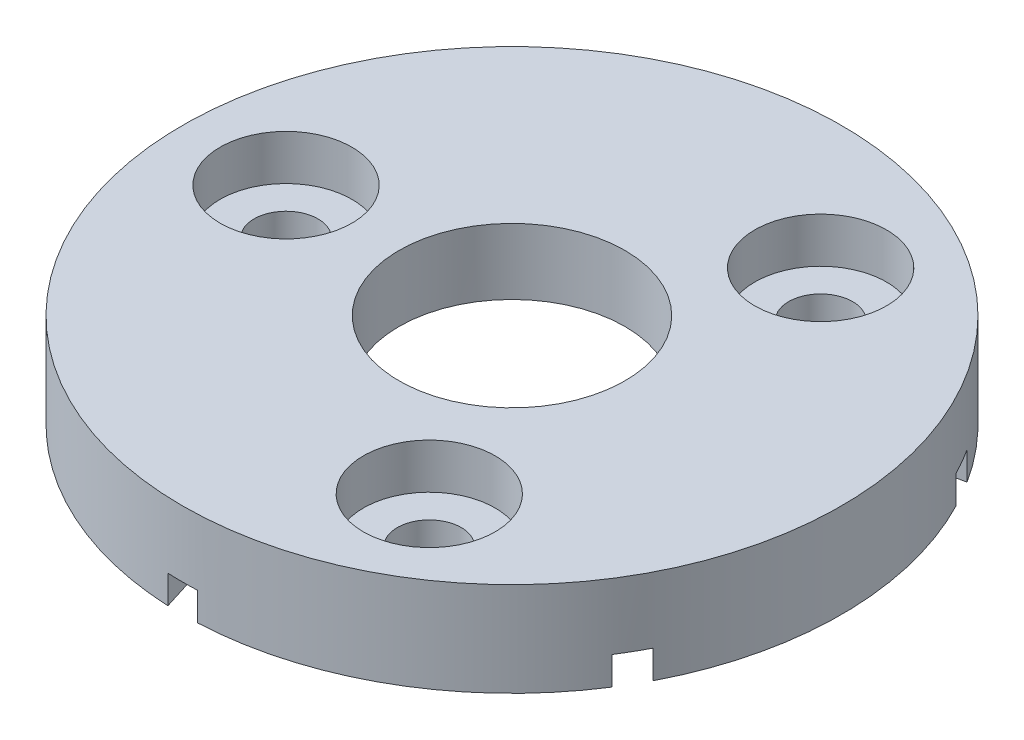
ISO-10303-21;
HEADER;
FILE_DESCRIPTION(('STEP AP214'),'2;1');
FILE_NAME('part.step','',(''),(''),'','','');
FILE_SCHEMA(('AUTOMOTIVE_DESIGN { 1 0 10303 214 1 1 1 1 }'));
ENDSEC;
DATA;
#1=APPLICATION_CONTEXT('core data for automotive mechanical design processes');
#2=APPLICATION_PROTOCOL_DEFINITION('international standard','automotive_design',2000,#1);
#3=PRODUCT_CONTEXT('',#1,'mechanical');
#4=PRODUCT('Part','Part','',(#3));
#5=PRODUCT_RELATED_PRODUCT_CATEGORY('part','',(#4));
#6=PRODUCT_DEFINITION_FORMATION('','',#4);
#7=PRODUCT_DEFINITION_CONTEXT('part definition',#1,'design');
#8=PRODUCT_DEFINITION('design','',#6,#7);
#9=PRODUCT_DEFINITION_SHAPE('','',#8);
#10=(LENGTH_UNIT() NAMED_UNIT(*) SI_UNIT(.MILLI.,.METRE.));
#11=(NAMED_UNIT(*) PLANE_ANGLE_UNIT() SI_UNIT($,.RADIAN.));
#12=(NAMED_UNIT(*) SI_UNIT($,.STERADIAN.) SOLID_ANGLE_UNIT());
#13=UNCERTAINTY_MEASURE_WITH_UNIT(LENGTH_MEASURE(1.E-05),#10,'distance_accuracy_value','');
#14=(GEOMETRIC_REPRESENTATION_CONTEXT(3) GLOBAL_UNCERTAINTY_ASSIGNED_CONTEXT((#13)) GLOBAL_UNIT_ASSIGNED_CONTEXT((#10,
#11,#12)) REPRESENTATION_CONTEXT('',''));
#15=CARTESIAN_POINT('',(0.,0.,0.));
#16=DIRECTION('',(0.,0.,1.));
#17=DIRECTION('',(1.,0.,0.));
#18=AXIS2_PLACEMENT_3D('',#15,#16,#17);
#19=CARTESIAN_POINT('',(0.,0.,0.));
#20=DIRECTION('',(0.,1.,0.));
#21=DIRECTION('',(0.,0.,1.));
#22=AXIS2_PLACEMENT_3D('',#19,#20,#21);
#23=PLANE('',#22);
#24=CARTESIAN_POINT('',(0.,0.,0.));
#25=DIRECTION('',(0.,1.,0.));
#26=DIRECTION('',(0.,0.,1.));
#27=AXIS2_PLACEMENT_3D('',#24,#25,#26);
#28=CIRCLE('',#27,17.5);
#29=CARTESIAN_POINT('',(-14.743996444278,0.,9.4268005628165));
#30=VERTEX_POINT('',#29);
#31=CARTESIAN_POINT('',(-0.79185054166957,0.,17.4820757554604));
#32=VERTEX_POINT('',#31);
#33=EDGE_CURVE('E323',#30,#32,#28,.T.);
#34=ORIENTED_EDGE('',*,*,#33,.F.);
#35=DIRECTION('',(-0.976135582092914,0.,0.217161979573147));
#36=VECTOR('',#35,1.);
#37=CARTESIAN_POINT('',(1.30297054408815,0.,5.85681378918936));
#38=LINE('',#37,#36);
#39=CARTESIAN_POINT('',(-4.07178711699633,0.,7.05254216424202));
#40=VERTEX_POINT('',#39);
#41=EDGE_CURVE('E222',#40,#30,#38,.T.);
#42=ORIENTED_EDGE('',*,*,#41,.F.);
#43=DIRECTION('',(-0.299999999999992,0.,-0.953939201416948));
#44=VECTOR('',#43,1.);
#45=CARTESIAN_POINT('',(0.,0.,20.));
#46=LINE('',#45,#44);
#47=EDGE_CURVE('E272',#32,#40,#46,.T.);
#48=ORIENTED_EDGE('',*,*,#47,.F.);
#49=EDGE_LOOP('',(#34,#42,#48));
#50=FACE_BOUND('',#49,.T.);
#51=ADVANCED_FACE('F33',(#50),#23,.F.);
#52=CARTESIAN_POINT('',(-12.,0.,0.));
#53=DIRECTION('',(0.,1.,0.));
#54=DIRECTION('',(0.,0.,1.));
#55=AXIS2_PLACEMENT_3D('',#52,#53,#54);
#56=CIRCLE('',#55,1.7);
#57=CARTESIAN_POINT('',(-12.,0.,1.7));
#58=VERTEX_POINT('',#57);
#59=EDGE_CURVE('E320',#58,#58,#56,.T.);
#60=ORIENTED_EDGE('',*,*,#59,.T.);
#61=EDGE_LOOP('',(#60));
#62=FACE_BOUND('',#61,.T.);
#63=DIRECTION('',(-0.676135582092918,0.,-0.736777221843802));
#64=VECTOR('',#63,1.);
#65=CARTESIAN_POINT('',(-4.42066425462892,0.,4.05681248615784));
#66=LINE('',#65,#64);
#67=CARTESIAN_POINT('',(-8.14357423399264,0.,0.));
#68=VERTEX_POINT('',#67);
#69=CARTESIAN_POINT('',(-15.5358469859475,0.,-8.05527519264398));
#70=VERTEX_POINT('',#69);
#71=EDGE_CURVE('E210',#68,#70,#66,.T.);
#72=ORIENTED_EDGE('',*,*,#71,.F.);
#73=DIRECTION('',(0.676135582092923,0.,-0.736777221843797));
#74=VECTOR('',#73,1.);
#75=CARTESIAN_POINT('',(-17.3205080756888,0.,9.99999999999996));
#76=LINE('',#75,#74);
#77=CARTESIAN_POINT('',(-15.5358469859476,0.,8.05527519264387));
#78=VERTEX_POINT('',#77);
#79=EDGE_CURVE('E227',#78,#68,#76,.T.);
#80=ORIENTED_EDGE('',*,*,#79,.F.);
#81=EDGE_CURVE('E330',#70,#78,#28,.T.);
#82=ORIENTED_EDGE('',*,*,#81,.F.);
#83=EDGE_LOOP('',(#72,#80,#82));
#84=FACE_BOUND('',#83,.T.);
#85=ADVANCED_FACE('F372',(#62,#84),#23,.F.);
#86=DIRECTION('',(0.299999999999992,0.,-0.953939201416948));
#87=VECTOR('',#86,1.);
#88=CARTESIAN_POINT('',(-5.72363479871706,0.,-1.8000013030315));
#89=LINE('',#88,#87);
#90=CARTESIAN_POINT('',(-4.07178711699632,0.,-7.05254216424206));
#91=VERTEX_POINT('',#90);
#92=CARTESIAN_POINT('',(-0.79185054166957,0.,-17.4820757554604));
#93=VERTEX_POINT('',#92);
#94=EDGE_CURVE('E198',#91,#93,#89,.T.);
#95=ORIENTED_EDGE('',*,*,#94,.F.);
#96=DIRECTION('',(0.976135582092913,0.,0.217161979573154));
#97=VECTOR('',#96,1.);
#98=CARTESIAN_POINT('',(-17.3205080756887,0.,-10.0000000000001));
#99=LINE('',#98,#97);
#100=CARTESIAN_POINT('',(-14.7439964442779,0.,-9.42680056281661));
#101=VERTEX_POINT('',#100);
#102=EDGE_CURVE('E215',#101,#91,#99,.T.);
#103=ORIENTED_EDGE('',*,*,#102,.F.);
#104=EDGE_CURVE('E334',#93,#101,#28,.T.);
#105=ORIENTED_EDGE('',*,*,#104,.F.);
#106=EDGE_LOOP('',(#95,#103,#105));
#107=FACE_BOUND('',#106,.T.);
#108=ADVANCED_FACE('F370',(#107),#23,.F.);
#109=CARTESIAN_POINT('',(6.00000000000005,0.,-10.3923048454132));
#110=DIRECTION('',(0.,1.,0.));
#111=DIRECTION('',(0.,0.,1.));
#112=AXIS2_PLACEMENT_3D('',#109,#110,#111);
#113=CIRCLE('',#112,1.7);
#114=CARTESIAN_POINT('',(6.00000000000005,0.,-8.69230484541324));
#115=VERTEX_POINT('',#114);
#116=EDGE_CURVE('E308',#115,#115,#113,.T.);
#117=ORIENTED_EDGE('',*,*,#116,.T.);
#118=EDGE_LOOP('',(#117));
#119=FACE_BOUND('',#118,.T.);
#120=DIRECTION('',(0.976135582092916,0.,-0.21716197957314));
#121=VECTOR('',#120,1.);
#122=CARTESIAN_POINT('',(-1.30297054408811,0.,-5.85681378918937));
#123=LINE('',#122,#121);
#124=CARTESIAN_POINT('',(4.07178711699634,0.,-7.05254216424198));
#125=VERTEX_POINT('',#124);
#126=CARTESIAN_POINT('',(14.7439964442781,0.,-9.4268005628164));
#127=VERTEX_POINT('',#126);
#128=EDGE_CURVE('E172',#125,#127,#123,.T.);
#129=ORIENTED_EDGE('',*,*,#128,.F.);
#130=DIRECTION('',(0.299999999999992,0.,0.953939201416948));
#131=VECTOR('',#130,1.);
#132=CARTESIAN_POINT('',(0.,0.,-20.));
#133=LINE('',#132,#131);
#134=CARTESIAN_POINT('',(0.79185054166957,0.,-17.4820757554604));
#135=VERTEX_POINT('',#134);
#136=EDGE_CURVE('E203',#135,#125,#133,.T.);
#137=ORIENTED_EDGE('',*,*,#136,.F.);
#138=EDGE_CURVE('E329',#127,#135,#28,.T.);
#139=ORIENTED_EDGE('',*,*,#138,.F.);
#140=EDGE_LOOP('',(#129,#137,#139));
#141=FACE_BOUND('',#140,.T.);
#142=ADVANCED_FACE('F345',(#119,#141),#23,.F.);
#143=DIRECTION('',(0.676135582092913,0.,0.736777221843807));
#144=VECTOR('',#143,1.);
#145=CARTESIAN_POINT('',(4.42066425462895,0.,-4.05681248615781));
#146=LINE('',#145,#144);
#147=CARTESIAN_POINT('',(8.14357423399264,0.,0.));
#148=VERTEX_POINT('',#147);
#149=CARTESIAN_POINT('',(15.5358469859475,0.,8.05527519264409));
#150=VERTEX_POINT('',#149);
#151=EDGE_CURVE('E176',#148,#150,#146,.T.);
#152=ORIENTED_EDGE('',*,*,#151,.F.);
#153=DIRECTION('',(-0.676135582092928,0.,0.736777221843793));
#154=VECTOR('',#153,1.);
#155=CARTESIAN_POINT('',(17.3205080756889,0.,-9.99999999999984));
#156=LINE('',#155,#154);
#157=CARTESIAN_POINT('',(15.5358469859476,0.,-8.05527519264376));
#158=VERTEX_POINT('',#157);
#159=EDGE_CURVE('E159',#158,#148,#156,.T.);
#160=ORIENTED_EDGE('',*,*,#159,.F.);
#161=EDGE_CURVE('E183',#150,#158,#28,.T.);
#162=ORIENTED_EDGE('',*,*,#161,.F.);
#163=EDGE_LOOP('',(#152,#160,#162));
#164=FACE_BOUND('',#163,.T.);
#165=ADVANCED_FACE('F182',(#164),#23,.F.);
#166=CARTESIAN_POINT('',(0.,5.,0.));
#167=DIRECTION('',(0.,-1.,0.));
#168=DIRECTION('',(0.,0.,-1.));
#169=AXIS2_PLACEMENT_3D('',#166,#167,#168);
#170=CYLINDRICAL_SURFACE('',#169,17.5);
#171=CARTESIAN_POINT('',(0.,5.,0.));
#172=DIRECTION('',(0.,1.,0.));
#173=DIRECTION('',(0.,0.,1.));
#174=AXIS2_PLACEMENT_3D('',#171,#172,#173);
#175=CIRCLE('',#174,17.5);
#176=CARTESIAN_POINT('',(0.,5.,17.5));
#177=VERTEX_POINT('',#176);
#178=EDGE_CURVE('E41',#177,#177,#175,.T.);
#179=ORIENTED_EDGE('',*,*,#178,.F.);
#180=EDGE_LOOP('',(#179));
#181=FACE_BOUND('',#180,.T.);
#182=CARTESIAN_POINT('',(0.,1.5,0.));
#183=DIRECTION('',(0.,1.,0.));
#184=DIRECTION('',(0.,0.,1.));
#185=AXIS2_PLACEMENT_3D('',#182,#183,#184);
#186=CIRCLE('',#185,17.5);
#187=CARTESIAN_POINT('',(-15.5358469859476,1.5,8.05527519264387));
#188=VERTEX_POINT('',#187);
#189=CARTESIAN_POINT('',(-14.743996444278,1.5,9.4268005628165));
#190=VERTEX_POINT('',#189);
#191=EDGE_CURVE('E243',#188,#190,#186,.T.);
#192=ORIENTED_EDGE('',*,*,#191,.T.);
#193=DIRECTION('',(0.,-1.,0.));
#194=VECTOR('',#193,1.);
#195=CARTESIAN_POINT('',(-14.743996444278,5.,9.4268005628165));
#196=LINE('',#195,#194);
#197=EDGE_CURVE('E240',#190,#30,#196,.T.);
#198=ORIENTED_EDGE('',*,*,#197,.T.);
#199=ORIENTED_EDGE('',*,*,#33,.T.);
#200=DIRECTION('',(0.,-1.,0.));
#201=VECTOR('',#200,1.);
#202=CARTESIAN_POINT('',(-0.791850541669571,5.,17.4820757554604));
#203=LINE('',#202,#201);
#204=CARTESIAN_POINT('',(-0.791850541669569,1.5,17.4820757554604));
#205=VERTEX_POINT('',#204);
#206=EDGE_CURVE('E278',#32,#205,#203,.F.);
#207=ORIENTED_EDGE('',*,*,#206,.T.);
#208=CARTESIAN_POINT('',(0.,1.5,0.));
#209=DIRECTION('',(0.,1.,0.));
#210=DIRECTION('',(0.,0.,1.));
#211=AXIS2_PLACEMENT_3D('',#208,#209,#210);
#212=CIRCLE('',#211,17.5);
#213=CARTESIAN_POINT('',(0.791850541669571,1.5,17.4820757554604));
#214=VERTEX_POINT('',#213);
#215=EDGE_CURVE('E48',#205,#214,#212,.T.);
#216=ORIENTED_EDGE('',*,*,#215,.T.);
#217=DIRECTION('',(0.,-1.,0.));
#218=VECTOR('',#217,1.);
#219=CARTESIAN_POINT('',(0.791850541669571,5.,17.4820757554604));
#220=LINE('',#219,#218);
#221=CARTESIAN_POINT('',(0.79185054166957,0.,17.4820757554604));
#222=VERTEX_POINT('',#221);
#223=EDGE_CURVE('E281',#214,#222,#220,.T.);
#224=ORIENTED_EDGE('',*,*,#223,.T.);
#225=CARTESIAN_POINT('',(14.7439964442779,0.,9.42680056281671));
#226=VERTEX_POINT('',#225);
#227=EDGE_CURVE('E325',#222,#226,#28,.T.);
#228=ORIENTED_EDGE('',*,*,#227,.T.);
#229=DIRECTION('',(0.,-1.,0.));
#230=VECTOR('',#229,1.);
#231=CARTESIAN_POINT('',(14.7439964442779,5.,9.42680056281671));
#232=LINE('',#231,#230);
#233=CARTESIAN_POINT('',(14.7439964442779,1.5,9.42680056281671));
#234=VERTEX_POINT('',#233);
#235=EDGE_CURVE('E234',#226,#234,#232,.F.);
#236=ORIENTED_EDGE('',*,*,#235,.T.);
#237=CARTESIAN_POINT('',(15.5358469859475,1.5,8.05527519264409));
#238=VERTEX_POINT('',#237);
#239=EDGE_CURVE('E247',#234,#238,#186,.T.);
#240=ORIENTED_EDGE('',*,*,#239,.T.);
#241=DIRECTION('',(0.,-1.,0.));
#242=VECTOR('',#241,1.);
#243=CARTESIAN_POINT('',(15.5358469859475,5.,8.05527519264409));
#244=LINE('',#243,#242);
#245=EDGE_CURVE('E248',#238,#150,#244,.T.);
#246=ORIENTED_EDGE('',*,*,#245,.T.);
#247=ORIENTED_EDGE('',*,*,#161,.T.);
#248=DIRECTION('',(0.,-1.,0.));
#249=VECTOR('',#248,1.);
#250=CARTESIAN_POINT('',(15.5358469859476,5.,-8.05527519264376));
#251=LINE('',#250,#249);
#252=CARTESIAN_POINT('',(15.5358469859476,1.5,-8.05527519264376));
#253=VERTEX_POINT('',#252);
#254=EDGE_CURVE('E166',#158,#253,#251,.F.);
#255=ORIENTED_EDGE('',*,*,#254,.T.);
#256=CARTESIAN_POINT('',(14.7439964442781,1.5,-9.4268005628164));
#257=VERTEX_POINT('',#256);
#258=EDGE_CURVE('E355',#253,#257,#186,.T.);
#259=ORIENTED_EDGE('',*,*,#258,.T.);
#260=DIRECTION('',(0.,-1.,0.));
#261=VECTOR('',#260,1.);
#262=CARTESIAN_POINT('',(14.7439964442781,5.,-9.4268005628164));
#263=LINE('',#262,#261);
#264=EDGE_CURVE('E251',#257,#127,#263,.T.);
#265=ORIENTED_EDGE('',*,*,#264,.T.);
#266=ORIENTED_EDGE('',*,*,#138,.T.);
#267=DIRECTION('',(0.,-1.,0.));
#268=VECTOR('',#267,1.);
#269=CARTESIAN_POINT('',(0.791850541669571,5.,-17.4820757554604));
#270=LINE('',#269,#268);
#271=CARTESIAN_POINT('',(0.791850541669572,1.5,-17.4820757554604));
#272=VERTEX_POINT('',#271);
#273=EDGE_CURVE('E254',#135,#272,#270,.F.);
#274=ORIENTED_EDGE('',*,*,#273,.T.);
#275=CARTESIAN_POINT('',(-0.791850541669572,1.5,-17.4820757554604));
#276=VERTEX_POINT('',#275);
#277=EDGE_CURVE('E356',#272,#276,#186,.T.);
#278=ORIENTED_EDGE('',*,*,#277,.T.);
#279=DIRECTION('',(0.,-1.,0.));
#280=VECTOR('',#279,1.);
#281=CARTESIAN_POINT('',(-0.791850541669571,5.,-17.4820757554604));
#282=LINE('',#281,#280);
#283=EDGE_CURVE('E257',#276,#93,#282,.T.);
#284=ORIENTED_EDGE('',*,*,#283,.T.);
#285=ORIENTED_EDGE('',*,*,#104,.T.);
#286=DIRECTION('',(0.,-1.,0.));
#287=VECTOR('',#286,1.);
#288=CARTESIAN_POINT('',(-14.7439964442779,5.,-9.4268005628166));
#289=LINE('',#288,#287);
#290=CARTESIAN_POINT('',(-14.7439964442779,1.5,-9.42680056281661));
#291=VERTEX_POINT('',#290);
#292=EDGE_CURVE('E260',#101,#291,#289,.F.);
#293=ORIENTED_EDGE('',*,*,#292,.T.);
#294=CARTESIAN_POINT('',(-15.5358469859475,1.5,-8.05527519264398));
#295=VERTEX_POINT('',#294);
#296=EDGE_CURVE('E246',#291,#295,#186,.T.);
#297=ORIENTED_EDGE('',*,*,#296,.T.);
#298=DIRECTION('',(0.,-1.,0.));
#299=VECTOR('',#298,1.);
#300=CARTESIAN_POINT('',(-15.5358469859475,5.,-8.05527519264397));
#301=LINE('',#300,#299);
#302=EDGE_CURVE('E263',#295,#70,#301,.T.);
#303=ORIENTED_EDGE('',*,*,#302,.T.);
#304=ORIENTED_EDGE('',*,*,#81,.T.);
#305=DIRECTION('',(0.,-1.,0.));
#306=VECTOR('',#305,1.);
#307=CARTESIAN_POINT('',(-15.5358469859476,5.,8.05527519264387));
#308=LINE('',#307,#306);
#309=EDGE_CURVE('E266',#78,#188,#308,.F.);
#310=ORIENTED_EDGE('',*,*,#309,.T.);
#311=EDGE_LOOP('',(#192,#198,#199,#207,#216,#224,#228,#236,#240,#246,#247,#255,#259,#265,#266,
#274,#278,#284,#285,#293,#297,#303,#304,#310));
#312=FACE_BOUND('',#311,.T.);
#313=ADVANCED_FACE('F35',(#181,#312),#170,.T.);
#314=CARTESIAN_POINT('',(0.,5.,0.));
#315=DIRECTION('',(0.,1.,0.));
#316=DIRECTION('',(0.,0.,1.));
#317=AXIS2_PLACEMENT_3D('',#314,#315,#316);
#318=PLANE('',#317);
#319=CARTESIAN_POINT('',(0.,5.,0.));
#320=DIRECTION('',(0.,-1.,0.));
#321=DIRECTION('',(0.,0.,-1.));
#322=AXIS2_PLACEMENT_3D('',#319,#320,#321);
#323=CIRCLE('',#322,6.);
#324=CARTESIAN_POINT('',(0.,5.,-6.));
#325=VERTEX_POINT('',#324);
#326=EDGE_CURVE('E284',#325,#325,#323,.T.);
#327=ORIENTED_EDGE('',*,*,#326,.T.);
#328=EDGE_LOOP('',(#327));
#329=FACE_BOUND('',#328,.T.);
#330=CARTESIAN_POINT('',(5.9999999999999,5.,10.3923048454133));
#331=DIRECTION('',(0.,1.,0.));
#332=DIRECTION('',(0.,0.,1.));
#333=AXIS2_PLACEMENT_3D('',#330,#331,#332);
#334=CIRCLE('',#333,3.5);
#335=CARTESIAN_POINT('',(5.9999999999999,5.,13.8923048454133));
#336=VERTEX_POINT('',#335);
#337=EDGE_CURVE('E287',#336,#336,#334,.T.);
#338=ORIENTED_EDGE('',*,*,#337,.F.);
#339=EDGE_LOOP('',(#338));
#340=FACE_BOUND('',#339,.T.);
#341=CARTESIAN_POINT('',(6.00000000000005,5.,-10.3923048454132));
#342=DIRECTION('',(0.,1.,0.));
#343=DIRECTION('',(0.,0.,1.));
#344=AXIS2_PLACEMENT_3D('',#341,#342,#343);
#345=CIRCLE('',#344,3.5);
#346=CARTESIAN_POINT('',(6.00000000000005,5.,-6.89230484541324));
#347=VERTEX_POINT('',#346);
#348=EDGE_CURVE('E299',#347,#347,#345,.T.);
#349=ORIENTED_EDGE('',*,*,#348,.F.);
#350=EDGE_LOOP('',(#349));
#351=FACE_BOUND('',#350,.T.);
#352=CARTESIAN_POINT('',(-12.,5.,0.));
#353=DIRECTION('',(0.,1.,0.));
#354=DIRECTION('',(0.,0.,1.));
#355=AXIS2_PLACEMENT_3D('',#352,#353,#354);
#356=CIRCLE('',#355,3.5);
#357=CARTESIAN_POINT('',(-12.,5.,3.5));
#358=VERTEX_POINT('',#357);
#359=EDGE_CURVE('E311',#358,#358,#356,.T.);
#360=ORIENTED_EDGE('',*,*,#359,.F.);
#361=EDGE_LOOP('',(#360));
#362=FACE_BOUND('',#361,.T.);
#363=ORIENTED_EDGE('',*,*,#178,.T.);
#364=EDGE_LOOP('',(#363));
#365=FACE_BOUND('',#364,.T.);
#366=ADVANCED_FACE('F387',(#329,#340,#351,#362,#365),#318,.T.);
#367=DIRECTION('',(-0.299999999999992,0.,0.953939201416948));
#368=VECTOR('',#367,1.);
#369=CARTESIAN_POINT('',(5.72363479871706,0.,1.8000013030315));
#370=LINE('',#369,#368);
#371=CARTESIAN_POINT('',(4.07178711699631,0.,7.05254216424209));
#372=VERTEX_POINT('',#371);
#373=EDGE_CURVE('E269',#372,#222,#370,.T.);
#374=ORIENTED_EDGE('',*,*,#373,.F.);
#375=DIRECTION('',(-0.976135582092911,0.,-0.217161979573161));
#376=VECTOR('',#375,1.);
#377=CARTESIAN_POINT('',(17.3205080756887,0.,10.0000000000002));
#378=LINE('',#377,#376);
#379=EDGE_CURVE('E184',#226,#372,#378,.T.);
#380=ORIENTED_EDGE('',*,*,#379,.F.);
#381=ORIENTED_EDGE('',*,*,#227,.F.);
#382=EDGE_LOOP('',(#374,#380,#381));
#383=FACE_BOUND('',#382,.T.);
#384=CARTESIAN_POINT('',(5.9999999999999,0.,10.3923048454133));
#385=DIRECTION('',(0.,1.,0.));
#386=DIRECTION('',(0.,0.,1.));
#387=AXIS2_PLACEMENT_3D('',#384,#385,#386);
#388=CIRCLE('',#387,1.7);
#389=CARTESIAN_POINT('',(5.9999999999999,0.,12.0923048454133));
#390=VERTEX_POINT('',#389);
#391=EDGE_CURVE('E296',#390,#390,#388,.T.);
#392=ORIENTED_EDGE('',*,*,#391,.T.);
#393=EDGE_LOOP('',(#392));
#394=FACE_BOUND('',#393,.T.);
#395=ADVANCED_FACE('F379',(#383,#394),#23,.F.);
#396=CARTESIAN_POINT('',(-12.,5.,0.));
#397=DIRECTION('',(0.,1.,0.));
#398=DIRECTION('',(0.,0.,1.));
#399=AXIS2_PLACEMENT_3D('',#396,#397,#398);
#400=CYLINDRICAL_SURFACE('',#399,1.7);
#401=ORIENTED_EDGE('',*,*,#59,.F.);
#402=EDGE_LOOP('',(#401));
#403=FACE_BOUND('',#402,.T.);
#404=CARTESIAN_POINT('',(-12.,2.6,0.));
#405=DIRECTION('',(0.,1.,0.));
#406=DIRECTION('',(0.,0.,1.));
#407=AXIS2_PLACEMENT_3D('',#404,#405,#406);
#408=CIRCLE('',#407,1.7);
#409=CARTESIAN_POINT('',(-12.,2.6,1.7));
#410=VERTEX_POINT('',#409);
#411=EDGE_CURVE('E317',#410,#410,#408,.T.);
#412=ORIENTED_EDGE('',*,*,#411,.T.);
#413=EDGE_LOOP('',(#412));
#414=FACE_BOUND('',#413,.T.);
#415=ADVANCED_FACE('F386',(#403,#414),#400,.F.);
#416=CARTESIAN_POINT('',(-10.3,2.6,0.));
#417=DIRECTION('',(0.,-1.,0.));
#418=DIRECTION('',(0.,0.,-1.));
#419=AXIS2_PLACEMENT_3D('',#416,#417,#418);
#420=PLANE('',#419);
#421=ORIENTED_EDGE('',*,*,#411,.F.);
#422=EDGE_LOOP('',(#421));
#423=FACE_BOUND('',#422,.T.);
#424=CARTESIAN_POINT('',(-12.,2.6,0.));
#425=DIRECTION('',(0.,1.,0.));
#426=DIRECTION('',(0.,0.,1.));
#427=AXIS2_PLACEMENT_3D('',#424,#425,#426);
#428=CIRCLE('',#427,3.5);
#429=CARTESIAN_POINT('',(-12.,2.6,3.5));
#430=VERTEX_POINT('',#429);
#431=EDGE_CURVE('E314',#430,#430,#428,.T.);
#432=ORIENTED_EDGE('',*,*,#431,.T.);
#433=EDGE_LOOP('',(#432));
#434=FACE_BOUND('',#433,.T.);
#435=ADVANCED_FACE('F393',(#423,#434),#420,.F.);
#436=CARTESIAN_POINT('',(-12.,5.,0.));
#437=DIRECTION('',(0.,1.,0.));
#438=DIRECTION('',(0.,0.,1.));
#439=AXIS2_PLACEMENT_3D('',#436,#437,#438);
#440=CYLINDRICAL_SURFACE('',#439,3.5);
#441=ORIENTED_EDGE('',*,*,#431,.F.);
#442=EDGE_LOOP('',(#441));
#443=FACE_BOUND('',#442,.T.);
#444=ORIENTED_EDGE('',*,*,#359,.T.);
#445=EDGE_LOOP('',(#444));
#446=FACE_BOUND('',#445,.T.);
#447=ADVANCED_FACE('F531',(#443,#446),#440,.F.);
#448=CARTESIAN_POINT('',(6.00000000000005,5.,-10.3923048454132));
#449=DIRECTION('',(0.,1.,0.));
#450=DIRECTION('',(0.,0.,1.));
#451=AXIS2_PLACEMENT_3D('',#448,#449,#450);
#452=CYLINDRICAL_SURFACE('',#451,1.7);
#453=ORIENTED_EDGE('',*,*,#116,.F.);
#454=EDGE_LOOP('',(#453));
#455=FACE_BOUND('',#454,.T.);
#456=CARTESIAN_POINT('',(6.00000000000005,2.6,-10.3923048454132));
#457=DIRECTION('',(0.,1.,0.));
#458=DIRECTION('',(0.,0.,1.));
#459=AXIS2_PLACEMENT_3D('',#456,#457,#458);
#460=CIRCLE('',#459,1.7);
#461=CARTESIAN_POINT('',(6.00000000000005,2.6,-8.69230484541324));
#462=VERTEX_POINT('',#461);
#463=EDGE_CURVE('E305',#462,#462,#460,.T.);
#464=ORIENTED_EDGE('',*,*,#463,.T.);
#465=EDGE_LOOP('',(#464));
#466=FACE_BOUND('',#465,.T.);
#467=ADVANCED_FACE('F522',(#455,#466),#452,.F.);
#468=CARTESIAN_POINT('',(7.70000000000005,2.6,-10.3923048454132));
#469=DIRECTION('',(0.,-1.,0.));
#470=DIRECTION('',(0.,0.,-1.));
#471=AXIS2_PLACEMENT_3D('',#468,#469,#470);
#472=PLANE('',#471);
#473=ORIENTED_EDGE('',*,*,#463,.F.);
#474=EDGE_LOOP('',(#473));
#475=FACE_BOUND('',#474,.T.);
#476=CARTESIAN_POINT('',(6.00000000000005,2.6,-10.3923048454132));
#477=DIRECTION('',(0.,1.,0.));
#478=DIRECTION('',(0.,0.,1.));
#479=AXIS2_PLACEMENT_3D('',#476,#477,#478);
#480=CIRCLE('',#479,3.5);
#481=CARTESIAN_POINT('',(6.00000000000005,2.6,-6.89230484541324));
#482=VERTEX_POINT('',#481);
#483=EDGE_CURVE('E302',#482,#482,#480,.T.);
#484=ORIENTED_EDGE('',*,*,#483,.T.);
#485=EDGE_LOOP('',(#484));
#486=FACE_BOUND('',#485,.T.);
#487=ADVANCED_FACE('F513',(#475,#486),#472,.F.);
#488=CARTESIAN_POINT('',(6.00000000000005,5.,-10.3923048454132));
#489=DIRECTION('',(0.,1.,0.));
#490=DIRECTION('',(0.,0.,1.));
#491=AXIS2_PLACEMENT_3D('',#488,#489,#490);
#492=CYLINDRICAL_SURFACE('',#491,3.5);
#493=ORIENTED_EDGE('',*,*,#483,.F.);
#494=EDGE_LOOP('',(#493));
#495=FACE_BOUND('',#494,.T.);
#496=ORIENTED_EDGE('',*,*,#348,.T.);
#497=EDGE_LOOP('',(#496));
#498=FACE_BOUND('',#497,.T.);
#499=ADVANCED_FACE('F504',(#495,#498),#492,.F.);
#500=CARTESIAN_POINT('',(5.9999999999999,5.,10.3923048454133));
#501=DIRECTION('',(0.,1.,0.));
#502=DIRECTION('',(0.,0.,1.));
#503=AXIS2_PLACEMENT_3D('',#500,#501,#502);
#504=CYLINDRICAL_SURFACE('',#503,1.7);
#505=ORIENTED_EDGE('',*,*,#391,.F.);
#506=EDGE_LOOP('',(#505));
#507=FACE_BOUND('',#506,.T.);
#508=CARTESIAN_POINT('',(5.9999999999999,2.6,10.3923048454133));
#509=DIRECTION('',(0.,1.,0.));
#510=DIRECTION('',(0.,0.,1.));
#511=AXIS2_PLACEMENT_3D('',#508,#509,#510);
#512=CIRCLE('',#511,1.7);
#513=CARTESIAN_POINT('',(5.9999999999999,2.6,12.0923048454133));
#514=VERTEX_POINT('',#513);
#515=EDGE_CURVE('E293',#514,#514,#512,.T.);
#516=ORIENTED_EDGE('',*,*,#515,.T.);
#517=EDGE_LOOP('',(#516));
#518=FACE_BOUND('',#517,.T.);
#519=ADVANCED_FACE('F495',(#507,#518),#504,.F.);
#520=CARTESIAN_POINT('',(7.6999999999999,2.6,10.3923048454133));
#521=DIRECTION('',(0.,-1.,0.));
#522=DIRECTION('',(0.,0.,-1.));
#523=AXIS2_PLACEMENT_3D('',#520,#521,#522);
#524=PLANE('',#523);
#525=ORIENTED_EDGE('',*,*,#515,.F.);
#526=EDGE_LOOP('',(#525));
#527=FACE_BOUND('',#526,.T.);
#528=CARTESIAN_POINT('',(5.9999999999999,2.6,10.3923048454133));
#529=DIRECTION('',(0.,1.,0.));
#530=DIRECTION('',(0.,0.,1.));
#531=AXIS2_PLACEMENT_3D('',#528,#529,#530);
#532=CIRCLE('',#531,3.5);
#533=CARTESIAN_POINT('',(5.9999999999999,2.6,13.8923048454133));
#534=VERTEX_POINT('',#533);
#535=EDGE_CURVE('E290',#534,#534,#532,.T.);
#536=ORIENTED_EDGE('',*,*,#535,.T.);
#537=EDGE_LOOP('',(#536));
#538=FACE_BOUND('',#537,.T.);
#539=ADVANCED_FACE('F488',(#527,#538),#524,.F.);
#540=CARTESIAN_POINT('',(5.9999999999999,5.,10.3923048454133));
#541=DIRECTION('',(0.,1.,0.));
#542=DIRECTION('',(0.,0.,1.));
#543=AXIS2_PLACEMENT_3D('',#540,#541,#542);
#544=CYLINDRICAL_SURFACE('',#543,3.5);
#545=ORIENTED_EDGE('',*,*,#535,.F.);
#546=EDGE_LOOP('',(#545));
#547=FACE_BOUND('',#546,.T.);
#548=ORIENTED_EDGE('',*,*,#337,.T.);
#549=EDGE_LOOP('',(#548));
#550=FACE_BOUND('',#549,.T.);
#551=ADVANCED_FACE('F418',(#547,#550),#544,.F.);
#552=CARTESIAN_POINT('',(0.,0.,0.));
#553=DIRECTION('',(0.,-1.,0.));
#554=DIRECTION('',(0.,0.,-1.));
#555=AXIS2_PLACEMENT_3D('',#552,#553,#554);
#556=CYLINDRICAL_SURFACE('',#555,6.);
#557=ORIENTED_EDGE('',*,*,#326,.F.);
#558=EDGE_LOOP('',(#557));
#559=FACE_BOUND('',#558,.T.);
#560=CARTESIAN_POINT('',(0.,1.5,0.));
#561=DIRECTION('',(0.,1.,0.));
#562=DIRECTION('',(0.,0.,1.));
#563=AXIS2_PLACEMENT_3D('',#560,#561,#562);
#564=CIRCLE('',#563,6.);
#565=CARTESIAN_POINT('',(0.,1.5,6.));
#566=VERTEX_POINT('',#565);
#567=EDGE_CURVE('E11',#566,#566,#564,.F.);
#568=ORIENTED_EDGE('',*,*,#567,.T.);
#569=EDGE_LOOP('',(#568));
#570=FACE_BOUND('',#569,.T.);
#571=ADVANCED_FACE('F474',(#559,#570),#556,.F.);
#572=CARTESIAN_POINT('',(5.72363479871706,1.5,1.8000013030315));
#573=DIRECTION('',(0.953939201416948,0.,0.299999999999992));
#574=DIRECTION('',(0.299999999999992,0.,-0.953939201416948));
#575=AXIS2_PLACEMENT_3D('',#572,#573,#574);
#576=PLANE('',#575);
#577=DIRECTION('',(-0.299999999999992,0.,0.953939201416948));
#578=VECTOR('',#577,1.);
#579=CARTESIAN_POINT('',(5.72363479871706,1.5,1.8000013030315));
#580=LINE('',#579,#578);
#581=CARTESIAN_POINT('',(4.07178711699631,1.5,7.05254216424209));
#582=VERTEX_POINT('',#581);
#583=EDGE_CURVE('E53',#582,#214,#580,.T.);
#584=ORIENTED_EDGE('',*,*,#583,.F.);
#585=DIRECTION('',(0.,-1.,0.));
#586=VECTOR('',#585,1.);
#587=CARTESIAN_POINT('',(4.0717871169963,1.5,7.05254216424209));
#588=LINE('',#587,#586);
#589=EDGE_CURVE('E229',#582,#372,#588,.T.);
#590=ORIENTED_EDGE('',*,*,#589,.T.);
#591=ORIENTED_EDGE('',*,*,#373,.T.);
#592=ORIENTED_EDGE('',*,*,#223,.F.);
#593=EDGE_LOOP('',(#584,#590,#591,#592));
#594=FACE_BOUND('',#593,.T.);
#595=ADVANCED_FACE('F465',(#594),#576,.F.);
#596=CARTESIAN_POINT('',(0.,1.5,20.));
#597=DIRECTION('',(-0.953939201416948,0.,0.299999999999992));
#598=DIRECTION('',(0.299999999999992,0.,0.953939201416948));
#599=AXIS2_PLACEMENT_3D('',#596,#597,#598);
#600=PLANE('',#599);
#601=ORIENTED_EDGE('',*,*,#47,.T.);
#602=DIRECTION('',(0.,1.,0.));
#603=VECTOR('',#602,1.);
#604=CARTESIAN_POINT('',(-4.07178711699633,1.5,7.05254216424202));
#605=LINE('',#604,#603);
#606=CARTESIAN_POINT('',(-4.07178711699633,1.5,7.05254216424202));
#607=VERTEX_POINT('',#606);
#608=EDGE_CURVE('E237',#40,#607,#605,.T.);
#609=ORIENTED_EDGE('',*,*,#608,.T.);
#610=DIRECTION('',(-0.299999999999992,0.,-0.953939201416948));
#611=VECTOR('',#610,1.);
#612=CARTESIAN_POINT('',(0.,1.5,20.));
#613=LINE('',#612,#611);
#614=EDGE_CURVE('E271',#205,#607,#613,.T.);
#615=ORIENTED_EDGE('',*,*,#614,.F.);
#616=ORIENTED_EDGE('',*,*,#206,.F.);
#617=EDGE_LOOP('',(#601,#609,#615,#616));
#618=FACE_BOUND('',#617,.T.);
#619=ADVANCED_FACE('F454',(#618),#600,.F.);
#620=CARTESIAN_POINT('',(0.,1.5,0.));
#621=DIRECTION('',(0.,1.,0.));
#622=DIRECTION('',(0.,0.,1.));
#623=AXIS2_PLACEMENT_3D('',#620,#621,#622);
#624=PLANE('',#623);
#625=DIRECTION('',(-0.976135582092911,0.,-0.217161979573161));
#626=VECTOR('',#625,1.);
#627=CARTESIAN_POINT('',(17.3205080756887,1.5,10.0000000000002));
#628=LINE('',#627,#626);
#629=EDGE_CURVE('E180',#234,#582,#628,.T.);
#630=ORIENTED_EDGE('',*,*,#629,.T.);
#631=ORIENTED_EDGE('',*,*,#583,.T.);
#632=ORIENTED_EDGE('',*,*,#215,.F.);
#633=ORIENTED_EDGE('',*,*,#614,.T.);
#634=DIRECTION('',(-0.976135582092914,0.,0.217161979573147));
#635=VECTOR('',#634,1.);
#636=CARTESIAN_POINT('',(1.30297054408815,1.5,5.85681378918936));
#637=LINE('',#636,#635);
#638=EDGE_CURVE('E223',#607,#190,#637,.T.);
#639=ORIENTED_EDGE('',*,*,#638,.T.);
#640=ORIENTED_EDGE('',*,*,#191,.F.);
#641=DIRECTION('',(0.676135582092923,0.,-0.736777221843797));
#642=VECTOR('',#641,1.);
#643=CARTESIAN_POINT('',(-17.3205080756888,1.5,9.99999999999996));
#644=LINE('',#643,#642);
#645=CARTESIAN_POINT('',(-8.14357423399264,1.5,0.));
#646=VERTEX_POINT('',#645);
#647=EDGE_CURVE('E226',#188,#646,#644,.T.);
#648=ORIENTED_EDGE('',*,*,#647,.T.);
#649=DIRECTION('',(-0.676135582092918,0.,-0.736777221843802));
#650=VECTOR('',#649,1.);
#651=CARTESIAN_POINT('',(-4.42066425462892,1.5,4.05681248615784));
#652=LINE('',#651,#650);
#653=EDGE_CURVE('E211',#646,#295,#652,.T.);
#654=ORIENTED_EDGE('',*,*,#653,.T.);
#655=ORIENTED_EDGE('',*,*,#296,.F.);
#656=DIRECTION('',(0.976135582092913,0.,0.217161979573154));
#657=VECTOR('',#656,1.);
#658=CARTESIAN_POINT('',(-17.3205080756887,1.5,-10.0000000000001));
#659=LINE('',#658,#657);
#660=CARTESIAN_POINT('',(-4.07178711699632,1.5,-7.05254216424206));
#661=VERTEX_POINT('',#660);
#662=EDGE_CURVE('E214',#291,#661,#659,.T.);
#663=ORIENTED_EDGE('',*,*,#662,.T.);
#664=DIRECTION('',(0.299999999999992,0.,-0.953939201416948));
#665=VECTOR('',#664,1.);
#666=CARTESIAN_POINT('',(-5.72363479871706,1.5,-1.8000013030315));
#667=LINE('',#666,#665);
#668=EDGE_CURVE('E199',#661,#276,#667,.T.);
#669=ORIENTED_EDGE('',*,*,#668,.T.);
#670=ORIENTED_EDGE('',*,*,#277,.F.);
#671=DIRECTION('',(0.299999999999992,0.,0.953939201416948));
#672=VECTOR('',#671,1.);
#673=CARTESIAN_POINT('',(0.,1.5,-20.));
#674=LINE('',#673,#672);
#675=CARTESIAN_POINT('',(4.07178711699634,1.5,-7.05254216424198));
#676=VERTEX_POINT('',#675);
#677=EDGE_CURVE('E202',#272,#676,#674,.T.);
#678=ORIENTED_EDGE('',*,*,#677,.T.);
#679=DIRECTION('',(0.976135582092916,0.,-0.21716197957314));
#680=VECTOR('',#679,1.);
#681=CARTESIAN_POINT('',(-1.30297054408811,1.5,-5.85681378918937));
#682=LINE('',#681,#680);
#683=EDGE_CURVE('E171',#676,#257,#682,.T.);
#684=ORIENTED_EDGE('',*,*,#683,.T.);
#685=ORIENTED_EDGE('',*,*,#258,.F.);
#686=DIRECTION('',(-0.676135582092928,0.,0.736777221843793));
#687=VECTOR('',#686,1.);
#688=CARTESIAN_POINT('',(17.3205080756889,1.5,-9.99999999999984));
#689=LINE('',#688,#687);
#690=CARTESIAN_POINT('',(8.14357423399264,1.5,0.));
#691=VERTEX_POINT('',#690);
#692=EDGE_CURVE('E192',#253,#691,#689,.T.);
#693=ORIENTED_EDGE('',*,*,#692,.T.);
#694=DIRECTION('',(0.676135582092913,0.,0.736777221843807));
#695=VECTOR('',#694,1.);
#696=CARTESIAN_POINT('',(4.42066425462895,1.5,-4.05681248615781));
#697=LINE('',#696,#695);
#698=EDGE_CURVE('E179',#691,#238,#697,.T.);
#699=ORIENTED_EDGE('',*,*,#698,.T.);
#700=ORIENTED_EDGE('',*,*,#239,.F.);
#701=EDGE_LOOP('',(#630,#631,#632,#633,#639,#640,#648,#654,#655,#663,#669,#670,#678,#684,#685,
#693,#699,#700));
#702=FACE_BOUND('',#701,.T.);
#703=ORIENTED_EDGE('',*,*,#567,.F.);
#704=EDGE_LOOP('',(#703));
#705=FACE_BOUND('',#704,.T.);
#706=ADVANCED_FACE('F353',(#702,#705),#624,.F.);
#707=CARTESIAN_POINT('',(-17.3205080756888,1.5,9.99999999999996));
#708=DIRECTION('',(-0.736777221843797,0.,-0.676135582092923));
#709=DIRECTION('',(-0.676135582092923,0.,0.736777221843797));
#710=AXIS2_PLACEMENT_3D('',#707,#708,#709);
#711=PLANE('',#710);
#712=ORIENTED_EDGE('',*,*,#79,.T.);
#713=DIRECTION('',(0.,1.,0.));
#714=VECTOR('',#713,1.);
#715=CARTESIAN_POINT('',(-8.14357423399264,1.5,0.));
#716=LINE('',#715,#714);
#717=EDGE_CURVE('E217',#68,#646,#716,.T.);
#718=ORIENTED_EDGE('',*,*,#717,.T.);
#719=ORIENTED_EDGE('',*,*,#647,.F.);
#720=ORIENTED_EDGE('',*,*,#309,.F.);
#721=EDGE_LOOP('',(#712,#718,#719,#720));
#722=FACE_BOUND('',#721,.T.);
#723=ADVANCED_FACE('F453',(#722),#711,.F.);
#724=CARTESIAN_POINT('',(-4.42066425462892,1.5,4.05681248615784));
#725=DIRECTION('',(-0.736777221843802,0.,0.676135582092918));
#726=DIRECTION('',(0.676135582092918,0.,0.736777221843802));
#727=AXIS2_PLACEMENT_3D('',#724,#725,#726);
#728=PLANE('',#727);
#729=ORIENTED_EDGE('',*,*,#653,.F.);
#730=ORIENTED_EDGE('',*,*,#717,.F.);
#731=ORIENTED_EDGE('',*,*,#71,.T.);
#732=ORIENTED_EDGE('',*,*,#302,.F.);
#733=EDGE_LOOP('',(#729,#730,#731,#732));
#734=FACE_BOUND('',#733,.T.);
#735=ADVANCED_FACE('F576',(#734),#728,.F.);
#736=CARTESIAN_POINT('',(-17.3205080756887,1.5,-10.0000000000001));
#737=DIRECTION('',(0.217161979573154,0.,-0.976135582092913));
#738=DIRECTION('',(-0.976135582092913,0.,-0.217161979573154));
#739=AXIS2_PLACEMENT_3D('',#736,#737,#738);
#740=PLANE('',#739);
#741=ORIENTED_EDGE('',*,*,#102,.T.);
#742=DIRECTION('',(0.,1.,0.));
#743=VECTOR('',#742,1.);
#744=CARTESIAN_POINT('',(-4.07178711699631,1.5,-7.05254216424206));
#745=LINE('',#744,#743);
#746=EDGE_CURVE('E205',#91,#661,#745,.T.);
#747=ORIENTED_EDGE('',*,*,#746,.T.);
#748=ORIENTED_EDGE('',*,*,#662,.F.);
#749=ORIENTED_EDGE('',*,*,#292,.F.);
#750=EDGE_LOOP('',(#741,#747,#748,#749));
#751=FACE_BOUND('',#750,.T.);
#752=ADVANCED_FACE('F362',(#751),#740,.F.);
#753=CARTESIAN_POINT('',(-5.72363479871706,1.5,-1.8000013030315));
#754=DIRECTION('',(-0.953939201416948,0.,-0.299999999999992));
#755=DIRECTION('',(-0.299999999999992,0.,0.953939201416948));
#756=AXIS2_PLACEMENT_3D('',#753,#754,#755);
#757=PLANE('',#756);
#758=ORIENTED_EDGE('',*,*,#668,.F.);
#759=ORIENTED_EDGE('',*,*,#746,.F.);
#760=ORIENTED_EDGE('',*,*,#94,.T.);
#761=ORIENTED_EDGE('',*,*,#283,.F.);
#762=EDGE_LOOP('',(#758,#759,#760,#761));
#763=FACE_BOUND('',#762,.T.);
#764=ADVANCED_FACE('F368',(#763),#757,.F.);
#765=CARTESIAN_POINT('',(0.,1.5,-20.));
#766=DIRECTION('',(0.953939201416948,0.,-0.299999999999992));
#767=DIRECTION('',(-0.299999999999992,0.,-0.953939201416948));
#768=AXIS2_PLACEMENT_3D('',#765,#766,#767);
#769=PLANE('',#768);
#770=ORIENTED_EDGE('',*,*,#136,.T.);
#771=DIRECTION('',(0.,1.,0.));
#772=VECTOR('',#771,1.);
#773=CARTESIAN_POINT('',(4.07178711699634,1.5,-7.05254216424199));
#774=LINE('',#773,#772);
#775=EDGE_CURVE('E194',#125,#676,#774,.T.);
#776=ORIENTED_EDGE('',*,*,#775,.T.);
#777=ORIENTED_EDGE('',*,*,#677,.F.);
#778=ORIENTED_EDGE('',*,*,#273,.F.);
#779=EDGE_LOOP('',(#770,#776,#777,#778));
#780=FACE_BOUND('',#779,.T.);
#781=ADVANCED_FACE('F348',(#780),#769,.F.);
#782=CARTESIAN_POINT('',(-1.30297054408811,1.5,-5.85681378918937));
#783=DIRECTION('',(-0.21716197957314,0.,-0.976135582092916));
#784=DIRECTION('',(-0.976135582092916,0.,0.21716197957314));
#785=AXIS2_PLACEMENT_3D('',#782,#783,#784);
#786=PLANE('',#785);
#787=ORIENTED_EDGE('',*,*,#683,.F.);
#788=ORIENTED_EDGE('',*,*,#775,.F.);
#789=ORIENTED_EDGE('',*,*,#128,.T.);
#790=ORIENTED_EDGE('',*,*,#264,.F.);
#791=EDGE_LOOP('',(#787,#788,#789,#790));
#792=FACE_BOUND('',#791,.T.);
#793=ADVANCED_FACE('F352',(#792),#786,.F.);
#794=CARTESIAN_POINT('',(17.3205080756889,1.5,-9.99999999999984));
#795=DIRECTION('',(0.736777221843793,0.,0.676135582092928));
#796=DIRECTION('',(0.676135582092928,0.,-0.736777221843793));
#797=AXIS2_PLACEMENT_3D('',#794,#795,#796);
#798=PLANE('',#797);
#799=ORIENTED_EDGE('',*,*,#159,.T.);
#800=DIRECTION('',(0.,1.,0.));
#801=VECTOR('',#800,1.);
#802=CARTESIAN_POINT('',(8.14357423399264,1.5,0.));
#803=LINE('',#802,#801);
#804=EDGE_CURVE('E163',#148,#691,#803,.T.);
#805=ORIENTED_EDGE('',*,*,#804,.T.);
#806=ORIENTED_EDGE('',*,*,#692,.F.);
#807=ORIENTED_EDGE('',*,*,#254,.F.);
#808=EDGE_LOOP('',(#799,#805,#806,#807));
#809=FACE_BOUND('',#808,.T.);
#810=ADVANCED_FACE('F161',(#809),#798,.F.);
#811=CARTESIAN_POINT('',(4.42066425462895,1.5,-4.05681248615781));
#812=DIRECTION('',(0.736777221843807,0.,-0.676135582092913));
#813=DIRECTION('',(-0.676135582092913,0.,-0.736777221843807));
#814=AXIS2_PLACEMENT_3D('',#811,#812,#813);
#815=PLANE('',#814);
#816=ORIENTED_EDGE('',*,*,#698,.F.);
#817=ORIENTED_EDGE('',*,*,#804,.F.);
#818=ORIENTED_EDGE('',*,*,#151,.T.);
#819=ORIENTED_EDGE('',*,*,#245,.F.);
#820=EDGE_LOOP('',(#816,#817,#818,#819));
#821=FACE_BOUND('',#820,.T.);
#822=ADVANCED_FACE('F175',(#821),#815,.F.);
#823=CARTESIAN_POINT('',(1.30297054408815,1.5,5.85681378918936));
#824=DIRECTION('',(0.217161979573147,0.,0.976135582092914));
#825=DIRECTION('',(0.976135582092914,0.,-0.217161979573147));
#826=AXIS2_PLACEMENT_3D('',#823,#824,#825);
#827=PLANE('',#826);
#828=ORIENTED_EDGE('',*,*,#638,.F.);
#829=ORIENTED_EDGE('',*,*,#608,.F.);
#830=ORIENTED_EDGE('',*,*,#41,.T.);
#831=ORIENTED_EDGE('',*,*,#197,.F.);
#832=EDGE_LOOP('',(#828,#829,#830,#831));
#833=FACE_BOUND('',#832,.T.);
#834=ADVANCED_FACE('F620',(#833),#827,.F.);
#835=CARTESIAN_POINT('',(17.3205080756887,1.5,10.0000000000002));
#836=DIRECTION('',(-0.217161979573161,0.,0.976135582092911));
#837=DIRECTION('',(0.976135582092911,0.,0.217161979573161));
#838=AXIS2_PLACEMENT_3D('',#835,#836,#837);
#839=PLANE('',#838);
#840=ORIENTED_EDGE('',*,*,#379,.T.);
#841=ORIENTED_EDGE('',*,*,#589,.F.);
#842=ORIENTED_EDGE('',*,*,#629,.F.);
#843=ORIENTED_EDGE('',*,*,#235,.F.);
#844=EDGE_LOOP('',(#840,#841,#842,#843));
#845=FACE_BOUND('',#844,.T.);
#846=ADVANCED_FACE('F627',(#845),#839,.F.);
#847=CLOSED_SHELL('',(#51,#85,#108,#142,#165,#313,#366,#395,#415,#435,#447,#467,#487,#499,#519,
#539,#551,#571,#595,#619,#706,#723,#735,#752,#764,#781,#793,#810,#822,#834,#846));
#848=MANIFOLD_SOLID_BREP('B2',#847);
#849=ADVANCED_BREP_SHAPE_REPRESENTATION('',(#18,#848),#14);
#850=SHAPE_DEFINITION_REPRESENTATION(#9,#849);
ENDSEC;
END-ISO-10303-21;
